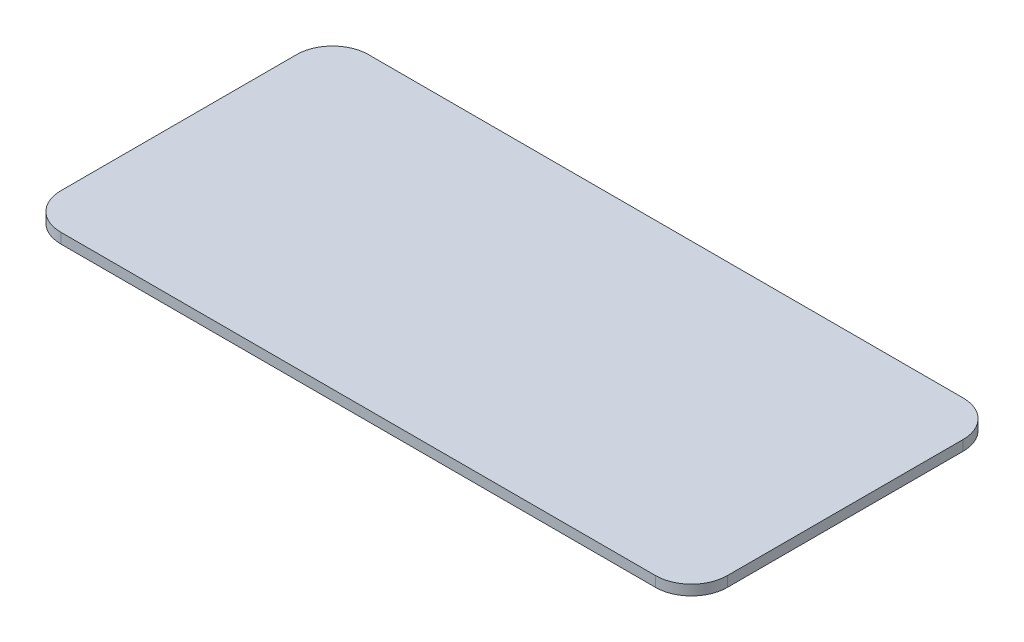
ISO-10303-21;
HEADER;
FILE_DESCRIPTION(('STEP AP214'),'2;1');
FILE_NAME('part.step','',(''),(''),'','','');
FILE_SCHEMA(('AUTOMOTIVE_DESIGN { 1 0 10303 214 1 1 1 1 }'));
ENDSEC;
DATA;
#1=APPLICATION_CONTEXT('core data for automotive mechanical design processes');
#2=APPLICATION_PROTOCOL_DEFINITION('international standard','automotive_design',2000,#1);
#3=PRODUCT_CONTEXT('',#1,'mechanical');
#4=PRODUCT('Part','Part','',(#3));
#5=PRODUCT_RELATED_PRODUCT_CATEGORY('part','',(#4));
#6=PRODUCT_DEFINITION_FORMATION('','',#4);
#7=PRODUCT_DEFINITION_CONTEXT('part definition',#1,'design');
#8=PRODUCT_DEFINITION('design','',#6,#7);
#9=PRODUCT_DEFINITION_SHAPE('','',#8);
#10=(LENGTH_UNIT() NAMED_UNIT(*) SI_UNIT(.MILLI.,.METRE.));
#11=(NAMED_UNIT(*) PLANE_ANGLE_UNIT() SI_UNIT($,.RADIAN.));
#12=(NAMED_UNIT(*) SI_UNIT($,.STERADIAN.) SOLID_ANGLE_UNIT());
#13=UNCERTAINTY_MEASURE_WITH_UNIT(LENGTH_MEASURE(1.E-05),#10,'distance_accuracy_value','');
#14=(GEOMETRIC_REPRESENTATION_CONTEXT(3) GLOBAL_UNCERTAINTY_ASSIGNED_CONTEXT((#13)) GLOBAL_UNIT_ASSIGNED_CONTEXT((#10,
#11,#12)) REPRESENTATION_CONTEXT('',''));
#15=CARTESIAN_POINT('',(0.,0.,0.));
#16=DIRECTION('',(0.,0.,1.));
#17=DIRECTION('',(1.,0.,0.));
#18=AXIS2_PLACEMENT_3D('',#15,#16,#17);
#19=CARTESIAN_POINT('',(-25.5235929008368,1.,-2.99557980719101));
#20=DIRECTION('',(0.,-1.,0.));
#21=DIRECTION('',(0.,0.,-1.));
#22=AXIS2_PLACEMENT_3D('',#19,#20,#21);
#23=CYLINDRICAL_SURFACE('',#22,3.5);
#24=CARTESIAN_POINT('',(-25.5235929008368,0.,-2.99557980719101));
#25=DIRECTION('',(0.,-1.,0.));
#26=DIRECTION('',(0.,0.,-1.));
#27=AXIS2_PLACEMENT_3D('',#24,#25,#26);
#28=CIRCLE('',#27,3.5);
#29=CARTESIAN_POINT('',(-25.5235929008368,0.,0.50442019280899));
#30=VERTEX_POINT('',#29);
#31=CARTESIAN_POINT('',(-29.0235929008368,0.,-2.99557980719104));
#32=VERTEX_POINT('',#31);
#33=EDGE_CURVE('E130',#30,#32,#28,.T.);
#34=ORIENTED_EDGE('',*,*,#33,.F.);
#35=DIRECTION('',(0.,-1.,0.));
#36=VECTOR('',#35,1.);
#37=CARTESIAN_POINT('',(-25.5235929008368,1.,0.50442019280899));
#38=LINE('',#37,#36);
#39=CARTESIAN_POINT('',(-25.5235929008368,1.,0.50442019280899));
#40=VERTEX_POINT('',#39);
#41=EDGE_CURVE('E11',#40,#30,#38,.T.);
#42=ORIENTED_EDGE('',*,*,#41,.F.);
#43=CARTESIAN_POINT('',(-25.5235929008368,1.,-2.99557980719101));
#44=DIRECTION('',(0.,-1.,0.));
#45=DIRECTION('',(0.,0.,-1.));
#46=AXIS2_PLACEMENT_3D('',#43,#44,#45);
#47=CIRCLE('',#46,3.5);
#48=CARTESIAN_POINT('',(-29.0235929008368,1.,-2.99557980719104));
#49=VERTEX_POINT('',#48);
#50=EDGE_CURVE('E147',#40,#49,#47,.T.);
#51=ORIENTED_EDGE('',*,*,#50,.T.);
#52=DIRECTION('',(0.,-1.,0.));
#53=VECTOR('',#52,1.);
#54=CARTESIAN_POINT('',(-29.0235929008368,1.,-2.99557980719104));
#55=LINE('',#54,#53);
#56=EDGE_CURVE('E36',#49,#32,#55,.T.);
#57=ORIENTED_EDGE('',*,*,#56,.T.);
#58=EDGE_LOOP('',(#34,#42,#51,#57));
#59=FACE_BOUND('',#58,.T.);
#60=ADVANCED_FACE('F33',(#59),#23,.T.);
#61=CARTESIAN_POINT('',(-25.5235929008368,1.,0.50442019280899));
#62=DIRECTION('',(0.,0.,-1.));
#63=DIRECTION('',(-1.,0.,0.));
#64=AXIS2_PLACEMENT_3D('',#61,#62,#63);
#65=PLANE('',#64);
#66=DIRECTION('',(1.,0.,0.));
#67=VECTOR('',#66,1.);
#68=CARTESIAN_POINT('',(-25.5235929008368,0.,0.50442019280899));
#69=LINE('',#68,#67);
#70=CARTESIAN_POINT('',(32.4764070991632,0.,0.50442019280899));
#71=VERTEX_POINT('',#70);
#72=EDGE_CURVE('E78',#30,#71,#69,.T.);
#73=ORIENTED_EDGE('',*,*,#72,.T.);
#74=DIRECTION('',(0.,-1.,0.));
#75=VECTOR('',#74,1.);
#76=CARTESIAN_POINT('',(32.4764070991632,1.,0.50442019280899));
#77=LINE('',#76,#75);
#78=CARTESIAN_POINT('',(32.4764070991632,1.,0.50442019280899));
#79=VERTEX_POINT('',#78);
#80=EDGE_CURVE('E42',#79,#71,#77,.T.);
#81=ORIENTED_EDGE('',*,*,#80,.F.);
#82=DIRECTION('',(1.,0.,0.));
#83=VECTOR('',#82,1.);
#84=CARTESIAN_POINT('',(-25.5235929008368,1.,0.50442019280899));
#85=LINE('',#84,#83);
#86=EDGE_CURVE('E108',#40,#79,#85,.T.);
#87=ORIENTED_EDGE('',*,*,#86,.F.);
#88=ORIENTED_EDGE('',*,*,#41,.T.);
#89=EDGE_LOOP('',(#73,#81,#87,#88));
#90=FACE_BOUND('',#89,.T.);
#91=ADVANCED_FACE('F187',(#90),#65,.F.);
#92=CARTESIAN_POINT('',(32.4764070991632,1.,-2.99557980719101));
#93=DIRECTION('',(0.,-1.,0.));
#94=DIRECTION('',(0.,0.,-1.));
#95=AXIS2_PLACEMENT_3D('',#92,#93,#94);
#96=CYLINDRICAL_SURFACE('',#95,3.5);
#97=CARTESIAN_POINT('',(32.4764070991632,0.,-2.99557980719101));
#98=DIRECTION('',(0.,1.,0.));
#99=DIRECTION('',(0.,0.,1.));
#100=AXIS2_PLACEMENT_3D('',#97,#98,#99);
#101=CIRCLE('',#100,3.5);
#102=CARTESIAN_POINT('',(35.9764070991632,0.,-2.99557980719103));
#103=VERTEX_POINT('',#102);
#104=EDGE_CURVE('E115',#71,#103,#101,.T.);
#105=ORIENTED_EDGE('',*,*,#104,.T.);
#106=DIRECTION('',(0.,-1.,0.));
#107=VECTOR('',#106,1.);
#108=CARTESIAN_POINT('',(35.9764070991632,1.,-2.99557980719103));
#109=LINE('',#108,#107);
#110=CARTESIAN_POINT('',(35.9764070991632,1.,-2.99557980719103));
#111=VERTEX_POINT('',#110);
#112=EDGE_CURVE('E112',#111,#103,#109,.T.);
#113=ORIENTED_EDGE('',*,*,#112,.F.);
#114=CARTESIAN_POINT('',(32.4764070991632,1.,-2.99557980719101));
#115=DIRECTION('',(0.,1.,0.));
#116=DIRECTION('',(0.,0.,1.));
#117=AXIS2_PLACEMENT_3D('',#114,#115,#116);
#118=CIRCLE('',#117,3.5);
#119=EDGE_CURVE('E103',#79,#111,#118,.T.);
#120=ORIENTED_EDGE('',*,*,#119,.F.);
#121=ORIENTED_EDGE('',*,*,#80,.T.);
#122=EDGE_LOOP('',(#105,#113,#120,#121));
#123=FACE_BOUND('',#122,.T.);
#124=ADVANCED_FACE('F113',(#123),#96,.T.);
#125=CARTESIAN_POINT('',(35.9764070991632,1.,-25.995579807191));
#126=DIRECTION('',(1.,0.,0.));
#127=DIRECTION('',(0.,0.,-1.));
#128=AXIS2_PLACEMENT_3D('',#125,#126,#127);
#129=PLANE('',#128);
#130=DIRECTION('',(0.,0.,1.));
#131=VECTOR('',#130,1.);
#132=CARTESIAN_POINT('',(35.9764070991632,0.,-25.995579807191));
#133=LINE('',#132,#131);
#134=CARTESIAN_POINT('',(35.9764070991632,0.,-25.995579807191));
#135=VERTEX_POINT('',#134);
#136=EDGE_CURVE('E144',#135,#103,#133,.T.);
#137=ORIENTED_EDGE('',*,*,#136,.F.);
#138=DIRECTION('',(0.,-1.,0.));
#139=VECTOR('',#138,1.);
#140=CARTESIAN_POINT('',(35.9764070991632,1.,-25.995579807191));
#141=LINE('',#140,#139);
#142=CARTESIAN_POINT('',(35.9764070991632,1.,-25.995579807191));
#143=VERTEX_POINT('',#142);
#144=EDGE_CURVE('E119',#143,#135,#141,.T.);
#145=ORIENTED_EDGE('',*,*,#144,.F.);
#146=DIRECTION('',(0.,0.,1.));
#147=VECTOR('',#146,1.);
#148=CARTESIAN_POINT('',(35.9764070991632,1.,-25.995579807191));
#149=LINE('',#148,#147);
#150=EDGE_CURVE('E107',#143,#111,#149,.T.);
#151=ORIENTED_EDGE('',*,*,#150,.T.);
#152=ORIENTED_EDGE('',*,*,#112,.T.);
#153=EDGE_LOOP('',(#137,#145,#151,#152));
#154=FACE_BOUND('',#153,.T.);
#155=ADVANCED_FACE('F121',(#154),#129,.T.);
#156=CARTESIAN_POINT('',(32.4764070991632,1.,-25.995579807191));
#157=DIRECTION('',(0.,-1.,0.));
#158=DIRECTION('',(0.,0.,-1.));
#159=AXIS2_PLACEMENT_3D('',#156,#157,#158);
#160=CYLINDRICAL_SURFACE('',#159,3.5);
#161=CARTESIAN_POINT('',(32.4764070991632,0.,-25.995579807191));
#162=DIRECTION('',(0.,1.,0.));
#163=DIRECTION('',(0.,0.,1.));
#164=AXIS2_PLACEMENT_3D('',#161,#162,#163);
#165=CIRCLE('',#164,3.5);
#166=CARTESIAN_POINT('',(32.4764070991631,0.,-29.495579807191));
#167=VERTEX_POINT('',#166);
#168=EDGE_CURVE('E141',#135,#167,#165,.T.);
#169=ORIENTED_EDGE('',*,*,#168,.T.);
#170=DIRECTION('',(0.,-1.,0.));
#171=VECTOR('',#170,1.);
#172=CARTESIAN_POINT('',(32.4764070991631,1.,-29.495579807191));
#173=LINE('',#172,#171);
#174=CARTESIAN_POINT('',(32.4764070991631,1.,-29.495579807191));
#175=VERTEX_POINT('',#174);
#176=EDGE_CURVE('E151',#175,#167,#173,.T.);
#177=ORIENTED_EDGE('',*,*,#176,.F.);
#178=CARTESIAN_POINT('',(32.4764070991632,1.,-25.995579807191));
#179=DIRECTION('',(0.,1.,0.));
#180=DIRECTION('',(0.,0.,1.));
#181=AXIS2_PLACEMENT_3D('',#178,#179,#180);
#182=CIRCLE('',#181,3.5);
#183=EDGE_CURVE('E123',#143,#175,#182,.T.);
#184=ORIENTED_EDGE('',*,*,#183,.F.);
#185=ORIENTED_EDGE('',*,*,#144,.T.);
#186=EDGE_LOOP('',(#169,#177,#184,#185));
#187=FACE_BOUND('',#186,.T.);
#188=ADVANCED_FACE('F167',(#187),#160,.T.);
#189=CARTESIAN_POINT('',(-25.5235929008368,1.,-29.495579807191));
#190=DIRECTION('',(0.,0.,-1.));
#191=DIRECTION('',(-1.,0.,0.));
#192=AXIS2_PLACEMENT_3D('',#189,#190,#191);
#193=PLANE('',#192);
#194=DIRECTION('',(1.,0.,0.));
#195=VECTOR('',#194,1.);
#196=CARTESIAN_POINT('',(-25.5235929008368,0.,-29.495579807191));
#197=LINE('',#196,#195);
#198=CARTESIAN_POINT('',(-25.5235929008368,0.,-29.495579807191));
#199=VERTEX_POINT('',#198);
#200=EDGE_CURVE('E138',#199,#167,#197,.T.);
#201=ORIENTED_EDGE('',*,*,#200,.F.);
#202=DIRECTION('',(0.,-1.,0.));
#203=VECTOR('',#202,1.);
#204=CARTESIAN_POINT('',(-25.5235929008368,1.,-29.495579807191));
#205=LINE('',#204,#203);
#206=CARTESIAN_POINT('',(-25.5235929008368,1.,-29.495579807191));
#207=VERTEX_POINT('',#206);
#208=EDGE_CURVE('E153',#207,#199,#205,.T.);
#209=ORIENTED_EDGE('',*,*,#208,.F.);
#210=DIRECTION('',(1.,0.,0.));
#211=VECTOR('',#210,1.);
#212=CARTESIAN_POINT('',(-25.5235929008368,1.,-29.495579807191));
#213=LINE('',#212,#211);
#214=EDGE_CURVE('E125',#207,#175,#213,.T.);
#215=ORIENTED_EDGE('',*,*,#214,.T.);
#216=ORIENTED_EDGE('',*,*,#176,.T.);
#217=EDGE_LOOP('',(#201,#209,#215,#216));
#218=FACE_BOUND('',#217,.T.);
#219=ADVANCED_FACE('F176',(#218),#193,.T.);
#220=CARTESIAN_POINT('',(-25.5235929008368,1.,-25.995579807191));
#221=DIRECTION('',(0.,-1.,0.));
#222=DIRECTION('',(0.,0.,-1.));
#223=AXIS2_PLACEMENT_3D('',#220,#221,#222);
#224=CYLINDRICAL_SURFACE('',#223,3.5);
#225=CARTESIAN_POINT('',(-25.5235929008368,0.,-25.995579807191));
#226=DIRECTION('',(0.,1.,0.));
#227=DIRECTION('',(0.,0.,1.));
#228=AXIS2_PLACEMENT_3D('',#225,#226,#227);
#229=CIRCLE('',#228,3.5);
#230=CARTESIAN_POINT('',(-29.0235929008368,0.,-25.995579807191));
#231=VERTEX_POINT('',#230);
#232=EDGE_CURVE('E136',#199,#231,#229,.T.);
#233=ORIENTED_EDGE('',*,*,#232,.T.);
#234=DIRECTION('',(0.,-1.,0.));
#235=VECTOR('',#234,1.);
#236=CARTESIAN_POINT('',(-29.0235929008368,1.,-25.995579807191));
#237=LINE('',#236,#235);
#238=CARTESIAN_POINT('',(-29.0235929008368,1.,-25.995579807191));
#239=VERTEX_POINT('',#238);
#240=EDGE_CURVE('E154',#239,#231,#237,.T.);
#241=ORIENTED_EDGE('',*,*,#240,.F.);
#242=CARTESIAN_POINT('',(-25.5235929008368,1.,-25.995579807191));
#243=DIRECTION('',(0.,1.,0.));
#244=DIRECTION('',(0.,0.,1.));
#245=AXIS2_PLACEMENT_3D('',#242,#243,#244);
#246=CIRCLE('',#245,3.5);
#247=EDGE_CURVE('E171',#207,#239,#246,.T.);
#248=ORIENTED_EDGE('',*,*,#247,.F.);
#249=ORIENTED_EDGE('',*,*,#208,.T.);
#250=EDGE_LOOP('',(#233,#241,#248,#249));
#251=FACE_BOUND('',#250,.T.);
#252=ADVANCED_FACE('F178',(#251),#224,.T.);
#253=CARTESIAN_POINT('',(-29.0235929008368,1.,-25.995579807191));
#254=DIRECTION('',(1.,0.,0.));
#255=DIRECTION('',(0.,0.,-1.));
#256=AXIS2_PLACEMENT_3D('',#253,#254,#255);
#257=PLANE('',#256);
#258=DIRECTION('',(0.,0.,1.));
#259=VECTOR('',#258,1.);
#260=CARTESIAN_POINT('',(-29.0235929008368,0.,-25.995579807191));
#261=LINE('',#260,#259);
#262=EDGE_CURVE('E133',#231,#32,#261,.T.);
#263=ORIENTED_EDGE('',*,*,#262,.T.);
#264=ORIENTED_EDGE('',*,*,#56,.F.);
#265=DIRECTION('',(0.,0.,1.));
#266=VECTOR('',#265,1.);
#267=CARTESIAN_POINT('',(-29.0235929008368,1.,-25.995579807191));
#268=LINE('',#267,#266);
#269=EDGE_CURVE('E88',#239,#49,#268,.T.);
#270=ORIENTED_EDGE('',*,*,#269,.F.);
#271=ORIENTED_EDGE('',*,*,#240,.T.);
#272=EDGE_LOOP('',(#263,#264,#270,#271));
#273=FACE_BOUND('',#272,.T.);
#274=ADVANCED_FACE('F159',(#273),#257,.F.);
#275=CARTESIAN_POINT('',(-25.5235929008368,1.,-2.99557980719101));
#276=DIRECTION('',(0.,-1.,0.));
#277=DIRECTION('',(0.,0.,-1.));
#278=AXIS2_PLACEMENT_3D('',#275,#276,#277);
#279=PLANE('',#278);
#280=ORIENTED_EDGE('',*,*,#50,.F.);
#281=ORIENTED_EDGE('',*,*,#86,.T.);
#282=ORIENTED_EDGE('',*,*,#119,.T.);
#283=ORIENTED_EDGE('',*,*,#150,.F.);
#284=ORIENTED_EDGE('',*,*,#183,.T.);
#285=ORIENTED_EDGE('',*,*,#214,.F.);
#286=ORIENTED_EDGE('',*,*,#247,.T.);
#287=ORIENTED_EDGE('',*,*,#269,.T.);
#288=EDGE_LOOP('',(#280,#281,#282,#283,#284,#285,#286,#287));
#289=FACE_BOUND('',#288,.T.);
#290=ADVANCED_FACE('F105',(#289),#279,.F.);
#291=CARTESIAN_POINT('',(-25.5235929008368,0.,-2.99557980719101));
#292=DIRECTION('',(0.,-1.,0.));
#293=DIRECTION('',(0.,0.,-1.));
#294=AXIS2_PLACEMENT_3D('',#291,#292,#293);
#295=PLANE('',#294);
#296=ORIENTED_EDGE('',*,*,#33,.T.);
#297=ORIENTED_EDGE('',*,*,#262,.F.);
#298=ORIENTED_EDGE('',*,*,#232,.F.);
#299=ORIENTED_EDGE('',*,*,#200,.T.);
#300=ORIENTED_EDGE('',*,*,#168,.F.);
#301=ORIENTED_EDGE('',*,*,#136,.T.);
#302=ORIENTED_EDGE('',*,*,#104,.F.);
#303=ORIENTED_EDGE('',*,*,#72,.F.);
#304=EDGE_LOOP('',(#296,#297,#298,#299,#300,#301,#302,#303));
#305=FACE_BOUND('',#304,.T.);
#306=ADVANCED_FACE('F162',(#305),#295,.T.);
#307=CLOSED_SHELL('',(#60,#91,#124,#155,#188,#219,#252,#274,#290,#306));
#308=MANIFOLD_SOLID_BREP('B2',#307);
#309=ADVANCED_BREP_SHAPE_REPRESENTATION('',(#18,#308),#14);
#310=SHAPE_DEFINITION_REPRESENTATION(#9,#309);
ENDSEC;
END-ISO-10303-21;
